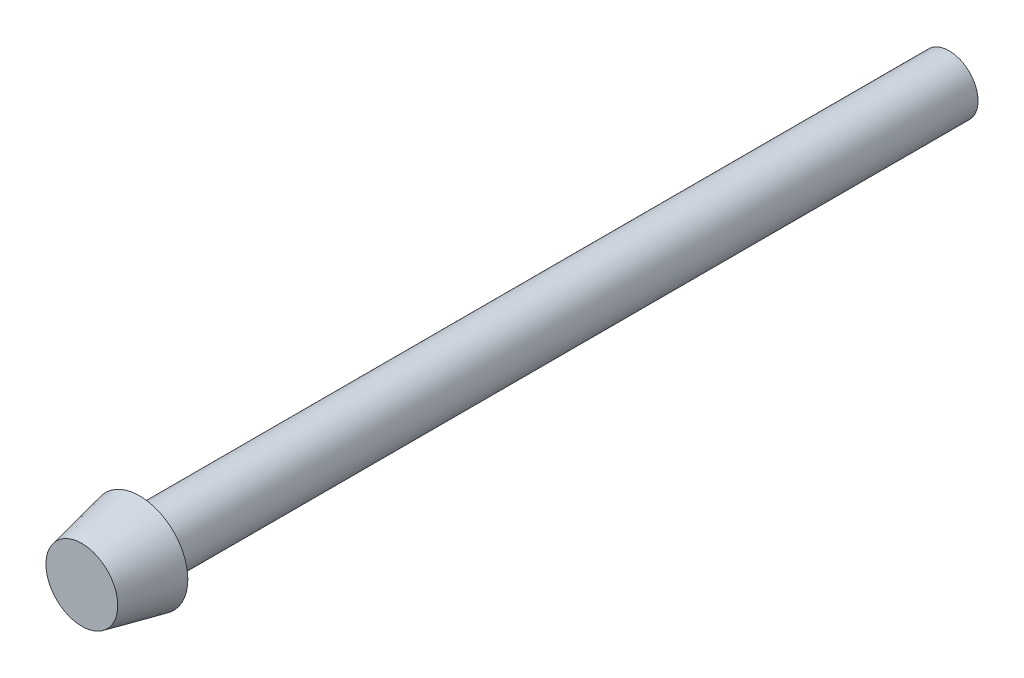
ISO-10303-21;
HEADER;
FILE_DESCRIPTION(('STEP AP214'),'2;1');
FILE_NAME('part.step','',(''),(''),'','','');
FILE_SCHEMA(('AUTOMOTIVE_DESIGN { 1 0 10303 214 1 1 1 1 }'));
ENDSEC;
DATA;
#1=APPLICATION_CONTEXT('core data for automotive mechanical design processes');
#2=APPLICATION_PROTOCOL_DEFINITION('international standard','automotive_design',2000,#1);
#3=PRODUCT_CONTEXT('',#1,'mechanical');
#4=PRODUCT('Part','Part','',(#3));
#5=PRODUCT_RELATED_PRODUCT_CATEGORY('part','',(#4));
#6=PRODUCT_DEFINITION_FORMATION('','',#4);
#7=PRODUCT_DEFINITION_CONTEXT('part definition',#1,'design');
#8=PRODUCT_DEFINITION('design','',#6,#7);
#9=PRODUCT_DEFINITION_SHAPE('','',#8);
#10=(LENGTH_UNIT() NAMED_UNIT(*) SI_UNIT(.MILLI.,.METRE.));
#11=(NAMED_UNIT(*) PLANE_ANGLE_UNIT() SI_UNIT($,.RADIAN.));
#12=(NAMED_UNIT(*) SI_UNIT($,.STERADIAN.) SOLID_ANGLE_UNIT());
#13=UNCERTAINTY_MEASURE_WITH_UNIT(LENGTH_MEASURE(1.E-05),#10,'distance_accuracy_value','');
#14=(GEOMETRIC_REPRESENTATION_CONTEXT(3) GLOBAL_UNCERTAINTY_ASSIGNED_CONTEXT((#13)) GLOBAL_UNIT_ASSIGNED_CONTEXT((#10,
#11,#12)) REPRESENTATION_CONTEXT('',''));
#15=CARTESIAN_POINT('',(0.,0.,0.));
#16=DIRECTION('',(0.,0.,1.));
#17=DIRECTION('',(1.,0.,0.));
#18=AXIS2_PLACEMENT_3D('',#15,#16,#17);
#19=CARTESIAN_POINT('',(0.,0.,42.));
#20=DIRECTION('',(0.,0.,-1.));
#21=DIRECTION('',(-1.,0.,0.));
#22=AXIS2_PLACEMENT_3D('',#19,#20,#21);
#23=CYLINDRICAL_SURFACE('',#22,1.5);
#24=CARTESIAN_POINT('',(0.,0.,42.));
#25=DIRECTION('',(0.,0.,1.));
#26=DIRECTION('',(1.,0.,0.));
#27=AXIS2_PLACEMENT_3D('',#24,#25,#26);
#28=CIRCLE('',#27,1.5);
#29=CARTESIAN_POINT('',(-1.5,0.,42.));
#30=VERTEX_POINT('',#29);
#31=EDGE_CURVE('E10',#30,#30,#28,.T.);
#32=CARTESIAN_POINT('',(0.,0.,0.));
#33=DIRECTION('',(0.,0.,1.));
#34=DIRECTION('',(1.,0.,0.));
#35=AXIS2_PLACEMENT_3D('',#32,#33,#34);
#36=CIRCLE('',#35,1.5);
#37=CARTESIAN_POINT('',(-1.5,0.,0.));
#38=VERTEX_POINT('',#37);
#39=EDGE_CURVE('E34',#38,#38,#36,.T.);
#40=CARTESIAN_POINT('',(-1.5,0.,42.));
#41=CARTESIAN_POINT('',(-1.5,0.,41.5625));
#42=CARTESIAN_POINT('',(-1.5,0.,41.125));
#43=CARTESIAN_POINT('',(-1.5,0.,40.25));
#44=CARTESIAN_POINT('',(-1.5,0.,39.8125));
#45=CARTESIAN_POINT('',(-1.5,0.,38.9375));
#46=CARTESIAN_POINT('',(-1.5,0.,38.5));
#47=CARTESIAN_POINT('',(-1.5,0.,37.625));
#48=CARTESIAN_POINT('',(-1.5,0.,37.1875));
#49=CARTESIAN_POINT('',(-1.5,0.,36.3125));
#50=CARTESIAN_POINT('',(-1.5,0.,35.875));
#51=CARTESIAN_POINT('',(-1.5,0.,35.));
#52=CARTESIAN_POINT('',(-1.5,0.,34.5625));
#53=CARTESIAN_POINT('',(-1.5,0.,33.6875));
#54=CARTESIAN_POINT('',(-1.5,0.,33.25));
#55=CARTESIAN_POINT('',(-1.5,0.,32.375));
#56=CARTESIAN_POINT('',(-1.5,0.,31.9375));
#57=CARTESIAN_POINT('',(-1.5,0.,31.0625));
#58=CARTESIAN_POINT('',(-1.5,0.,30.625));
#59=CARTESIAN_POINT('',(-1.5,0.,29.75));
#60=CARTESIAN_POINT('',(-1.5,0.,29.3125));
#61=CARTESIAN_POINT('',(-1.5,0.,28.4375));
#62=CARTESIAN_POINT('',(-1.5,0.,28.));
#63=CARTESIAN_POINT('',(-1.5,0.,27.125));
#64=CARTESIAN_POINT('',(-1.5,0.,26.6875));
#65=CARTESIAN_POINT('',(-1.5,0.,25.8125));
#66=CARTESIAN_POINT('',(-1.5,0.,25.375));
#67=CARTESIAN_POINT('',(-1.5,0.,24.5));
#68=CARTESIAN_POINT('',(-1.5,0.,24.0625));
#69=CARTESIAN_POINT('',(-1.5,0.,23.1875));
#70=CARTESIAN_POINT('',(-1.5,0.,22.75));
#71=CARTESIAN_POINT('',(-1.5,0.,21.875));
#72=CARTESIAN_POINT('',(-1.5,0.,21.4375));
#73=CARTESIAN_POINT('',(-1.5,0.,20.5625));
#74=CARTESIAN_POINT('',(-1.5,0.,20.125));
#75=CARTESIAN_POINT('',(-1.5,0.,19.25));
#76=CARTESIAN_POINT('',(-1.5,0.,18.8125));
#77=CARTESIAN_POINT('',(-1.5,0.,17.9375));
#78=CARTESIAN_POINT('',(-1.5,0.,17.5));
#79=CARTESIAN_POINT('',(-1.5,0.,16.625));
#80=CARTESIAN_POINT('',(-1.5,0.,16.1875));
#81=CARTESIAN_POINT('',(-1.5,0.,15.3125));
#82=CARTESIAN_POINT('',(-1.5,0.,14.875));
#83=CARTESIAN_POINT('',(-1.5,0.,14.));
#84=CARTESIAN_POINT('',(-1.5,0.,13.5625));
#85=CARTESIAN_POINT('',(-1.5,0.,12.6875));
#86=CARTESIAN_POINT('',(-1.5,0.,12.25));
#87=CARTESIAN_POINT('',(-1.5,0.,11.375));
#88=CARTESIAN_POINT('',(-1.5,0.,10.9375));
#89=CARTESIAN_POINT('',(-1.5,0.,10.0625));
#90=CARTESIAN_POINT('',(-1.5,0.,9.625));
#91=CARTESIAN_POINT('',(-1.5,0.,8.75));
#92=CARTESIAN_POINT('',(-1.5,0.,8.3125));
#93=CARTESIAN_POINT('',(-1.5,0.,7.4375));
#94=CARTESIAN_POINT('',(-1.5,0.,7.));
#95=CARTESIAN_POINT('',(-1.5,0.,6.125));
#96=CARTESIAN_POINT('',(-1.5,0.,5.6875));
#97=CARTESIAN_POINT('',(-1.5,0.,4.8125));
#98=CARTESIAN_POINT('',(-1.5,0.,4.375));
#99=CARTESIAN_POINT('',(-1.5,0.,3.5));
#100=CARTESIAN_POINT('',(-1.5,0.,3.0625));
#101=CARTESIAN_POINT('',(-1.5,0.,2.1875));
#102=CARTESIAN_POINT('',(-1.5,0.,1.75));
#103=CARTESIAN_POINT('',(-1.5,0.,0.875000000000001));
#104=CARTESIAN_POINT('',(-1.5,0.,0.4375));
#105=CARTESIAN_POINT('',(-1.5,0.,0.));
#106=B_SPLINE_CURVE_WITH_KNOTS('',3,(#40,#41,#42,#43,#44,#45,#46,#47,#48,#49,#50,#51,#52,#53,
#54,#55,#56,#57,#58,#59,#60,#61,#62,#63,#64,#65,#66,#67,#68,#69,#70,#71,#72,#73,#74,#75,#76,#77,
#78,#79,#80,#81,#82,#83,#84,#85,#86,#87,#88,#89,#90,#91,#92,#93,#94,#95,#96,#97,#98,#99,#100,
#101,#102,#103,#104,#105),.UNSPECIFIED.,.F.,.F.,(4,2,2,2,2,2,2,2,2,2,2,2,2,2,2,2,2,2,2,2,2,2,2,
2,2,2,2,2,2,2,2,2,4),(0.,1.31249999999999,2.625,3.9375,5.25,6.5625,7.87499999999999,
9.18749999999999,10.5,11.8125,13.125,14.4375,15.75,17.0625,18.375,19.6875,21.,22.3125,23.625,
24.9375,26.25,27.5625,28.875,30.1875,31.5,32.8125,34.125,35.4375,36.75,38.0625,39.375,40.6875,
42.),.UNSPECIFIED.);
#107=EDGE_CURVE('BSEAM31',#30,#38,#106,.T.);
#108=ORIENTED_EDGE('',*,*,#31,.F.);
#109=ORIENTED_EDGE('',*,*,#39,.T.);
#110=ORIENTED_EDGE('',*,*,#107,.T.);
#111=ORIENTED_EDGE('',*,*,#107,.F.);
#112=EDGE_LOOP('',(#108,#110,#109,#111));
#113=FACE_BOUND('',#112,.T.);
#114=ADVANCED_FACE('F31',(#113),#23,.T.);
#115=CARTESIAN_POINT('',(0.,0.,0.));
#116=DIRECTION('',(0.,0.,1.));
#117=DIRECTION('',(1.,0.,0.));
#118=AXIS2_PLACEMENT_3D('',#115,#116,#117);
#119=PLANE('',#118);
#120=ORIENTED_EDGE('',*,*,#39,.F.);
#121=EDGE_LOOP('',(#120));
#122=FACE_BOUND('',#121,.T.);
#123=ADVANCED_FACE('F62',(#122),#119,.F.);
#124=CARTESIAN_POINT('',(0.,0.,42.));
#125=DIRECTION('',(0.,0.,-1.));
#126=DIRECTION('',(1.,0.,0.));
#127=AXIS2_PLACEMENT_3D('',#124,#125,#126);
#128=CONICAL_SURFACE('',#127,2.5,0.20943951023932);
#129=CARTESIAN_POINT('',(0.,0.,45.));
#130=DIRECTION('',(0.,0.,1.));
#131=DIRECTION('',(1.,0.,0.));
#132=AXIS2_PLACEMENT_3D('',#129,#130,#131);
#133=CIRCLE('',#132,1.86233031498993);
#134=CARTESIAN_POINT('',(1.86233031498993,0.,45.));
#135=VERTEX_POINT('',#134);
#136=EDGE_CURVE('E41',#135,#135,#133,.T.);
#137=ORIENTED_EDGE('',*,*,#136,.F.);
#138=EDGE_LOOP('',(#137));
#139=FACE_BOUND('',#138,.T.);
#140=CARTESIAN_POINT('',(0.,0.,42.));
#141=DIRECTION('',(0.,0.,1.));
#142=DIRECTION('',(1.,0.,0.));
#143=AXIS2_PLACEMENT_3D('',#140,#141,#142);
#144=CIRCLE('',#143,2.5);
#145=CARTESIAN_POINT('',(2.5,0.,42.));
#146=VERTEX_POINT('',#145);
#147=EDGE_CURVE('E45',#146,#146,#144,.T.);
#148=ORIENTED_EDGE('',*,*,#147,.T.);
#149=EDGE_LOOP('',(#148));
#150=FACE_BOUND('',#149,.T.);
#151=ADVANCED_FACE('F49',(#139,#150),#128,.T.);
#152=CARTESIAN_POINT('',(0.,0.,45.));
#153=DIRECTION('',(0.,0.,1.));
#154=DIRECTION('',(1.,0.,0.));
#155=AXIS2_PLACEMENT_3D('',#152,#153,#154);
#156=PLANE('',#155);
#157=ORIENTED_EDGE('',*,*,#136,.T.);
#158=EDGE_LOOP('',(#157));
#159=FACE_BOUND('',#158,.T.);
#160=ADVANCED_FACE('F53',(#159),#156,.T.);
#161=CARTESIAN_POINT('',(0.,0.,42.));
#162=DIRECTION('',(0.,0.,1.));
#163=DIRECTION('',(1.,0.,0.));
#164=AXIS2_PLACEMENT_3D('',#161,#162,#163);
#165=PLANE('',#164);
#166=ORIENTED_EDGE('',*,*,#31,.T.);
#167=EDGE_LOOP('',(#166));
#168=FACE_BOUND('',#167,.T.);
#169=ORIENTED_EDGE('',*,*,#147,.F.);
#170=EDGE_LOOP('',(#169));
#171=FACE_BOUND('',#170,.T.);
#172=ADVANCED_FACE('F51',(#168,#171),#165,.F.);
#173=CLOSED_SHELL('',(#114,#123,#151,#160,#172));
#174=MANIFOLD_SOLID_BREP('B2',#173);
#175=ADVANCED_BREP_SHAPE_REPRESENTATION('',(#18,#174),#14);
#176=SHAPE_DEFINITION_REPRESENTATION(#9,#175);
ENDSEC;
END-ISO-10303-21;
